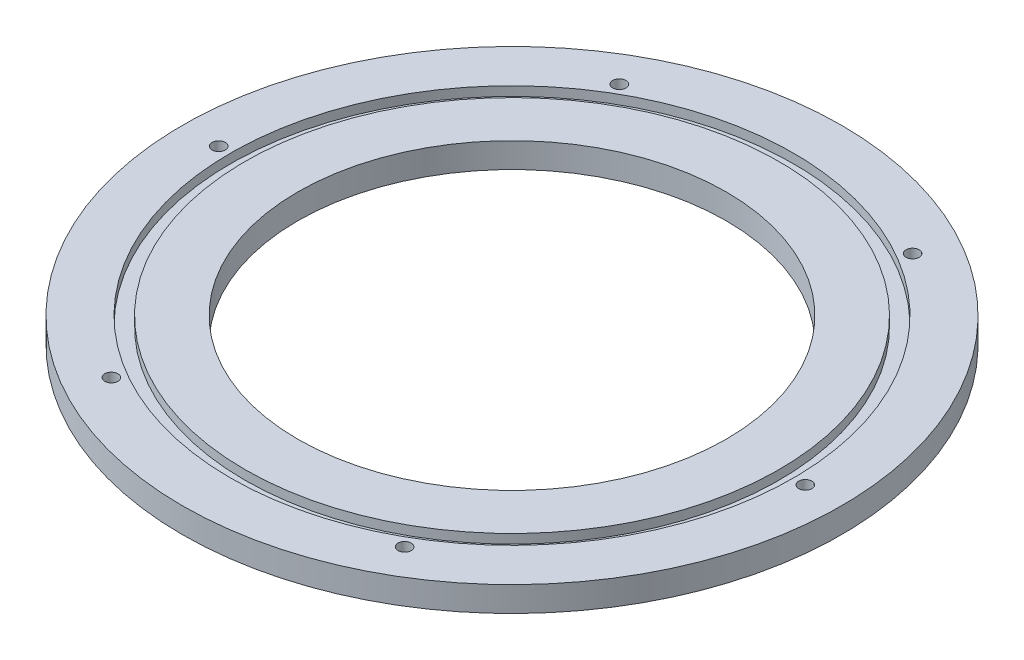
ISO-10303-21;
HEADER;
FILE_DESCRIPTION(('STEP AP214'),'2;1');
FILE_NAME('part.step','',(''),(''),'','','');
FILE_SCHEMA(('AUTOMOTIVE_DESIGN { 1 0 10303 214 1 1 1 1 }'));
ENDSEC;
DATA;
#1=APPLICATION_CONTEXT('core data for automotive mechanical design processes');
#2=APPLICATION_PROTOCOL_DEFINITION('international standard','automotive_design',2000,#1);
#3=PRODUCT_CONTEXT('',#1,'mechanical');
#4=PRODUCT('Part','Part','',(#3));
#5=PRODUCT_RELATED_PRODUCT_CATEGORY('part','',(#4));
#6=PRODUCT_DEFINITION_FORMATION('','',#4);
#7=PRODUCT_DEFINITION_CONTEXT('part definition',#1,'design');
#8=PRODUCT_DEFINITION('design','',#6,#7);
#9=PRODUCT_DEFINITION_SHAPE('','',#8);
#10=(LENGTH_UNIT() NAMED_UNIT(*) SI_UNIT(.MILLI.,.METRE.));
#11=(NAMED_UNIT(*) PLANE_ANGLE_UNIT() SI_UNIT($,.RADIAN.));
#12=(NAMED_UNIT(*) SI_UNIT($,.STERADIAN.) SOLID_ANGLE_UNIT());
#13=UNCERTAINTY_MEASURE_WITH_UNIT(LENGTH_MEASURE(1.E-05),#10,'distance_accuracy_value','');
#14=(GEOMETRIC_REPRESENTATION_CONTEXT(3) GLOBAL_UNCERTAINTY_ASSIGNED_CONTEXT((#13)) GLOBAL_UNIT_ASSIGNED_CONTEXT((#10,
#11,#12)) REPRESENTATION_CONTEXT('',''));
#15=CARTESIAN_POINT('',(0.,0.,0.));
#16=DIRECTION('',(0.,0.,1.));
#17=DIRECTION('',(1.,0.,0.));
#18=AXIS2_PLACEMENT_3D('',#15,#16,#17);
#19=CARTESIAN_POINT('',(0.,9.5,0.));
#20=DIRECTION('',(0.,1.,0.));
#21=DIRECTION('',(0.,0.,1.));
#22=AXIS2_PLACEMENT_3D('',#19,#20,#21);
#23=PLANE('',#22);
#24=CARTESIAN_POINT('',(0.,9.5,0.));
#25=DIRECTION('',(0.,1.,0.));
#26=DIRECTION('',(0.,0.,1.));
#27=AXIS2_PLACEMENT_3D('',#24,#25,#26);
#28=CIRCLE('',#27,162.5);
#29=CARTESIAN_POINT('',(0.,9.5,162.5));
#30=VERTEX_POINT('',#29);
#31=EDGE_CURVE('E48',#30,#30,#28,.T.);
#32=ORIENTED_EDGE('',*,*,#31,.F.);
#33=EDGE_LOOP('',(#32));
#34=FACE_BOUND('',#33,.T.);
#35=CARTESIAN_POINT('',(0.,9.5,0.));
#36=DIRECTION('',(0.,1.,0.));
#37=DIRECTION('',(0.,0.,1.));
#38=AXIS2_PLACEMENT_3D('',#35,#36,#37);
#39=CIRCLE('',#38,202.5);
#40=CARTESIAN_POINT('',(0.,9.5,202.5));
#41=VERTEX_POINT('',#40);
#42=EDGE_CURVE('E62',#41,#41,#39,.T.);
#43=ORIENTED_EDGE('',*,*,#42,.T.);
#44=EDGE_LOOP('',(#43));
#45=FACE_BOUND('',#44,.T.);
#46=ADVANCED_FACE('F37',(#34,#45),#23,.T.);
#47=CARTESIAN_POINT('',(-111.250000000001,9.5,-192.690652342037));
#48=DIRECTION('',(0.,-1.,0.));
#49=DIRECTION('',(0.,0.,-1.));
#50=AXIS2_PLACEMENT_3D('',#47,#48,#49);
#51=CIRCLE('',#50,5.00000000000001);
#52=CARTESIAN_POINT('',(-111.250000000001,9.5,-197.690652342037));
#53=VERTEX_POINT('',#52);
#54=EDGE_CURVE('E89',#53,#53,#51,.T.);
#55=ORIENTED_EDGE('',*,*,#54,.T.);
#56=EDGE_LOOP('',(#55));
#57=FACE_BOUND('',#56,.T.);
#58=CARTESIAN_POINT('',(-111.250000000001,9.5,192.690652342037));
#59=DIRECTION('',(0.,-1.,0.));
#60=DIRECTION('',(0.,0.,1.));
#61=AXIS2_PLACEMENT_3D('',#58,#59,#60);
#62=CIRCLE('',#61,5.00000000000001);
#63=CARTESIAN_POINT('',(-111.250000000001,9.5,197.690652342037));
#64=VERTEX_POINT('',#63);
#65=EDGE_CURVE('E78',#64,#64,#62,.T.);
#66=ORIENTED_EDGE('',*,*,#65,.T.);
#67=EDGE_LOOP('',(#66));
#68=FACE_BOUND('',#67,.T.);
#69=CARTESIAN_POINT('',(-222.5,9.5,-1.55431223447522E-12));
#70=DIRECTION('',(0.,-1.,0.));
#71=DIRECTION('',(0.,0.,1.));
#72=AXIS2_PLACEMENT_3D('',#69,#70,#71);
#73=CIRCLE('',#72,4.99999999999992);
#74=CARTESIAN_POINT('',(-222.5,9.5,4.99999999999837));
#75=VERTEX_POINT('',#74);
#76=EDGE_CURVE('E77',#75,#75,#73,.T.);
#77=ORIENTED_EDGE('',*,*,#76,.T.);
#78=EDGE_LOOP('',(#77));
#79=FACE_BOUND('',#78,.T.);
#80=CARTESIAN_POINT('',(222.5,9.5,0.));
#81=DIRECTION('',(0.,-1.,0.));
#82=DIRECTION('',(0.,0.,-1.));
#83=AXIS2_PLACEMENT_3D('',#80,#81,#82);
#84=CIRCLE('',#83,4.99999999999999);
#85=CARTESIAN_POINT('',(222.5,9.5,-4.99999999999999));
#86=VERTEX_POINT('',#85);
#87=EDGE_CURVE('E71',#86,#86,#84,.T.);
#88=ORIENTED_EDGE('',*,*,#87,.T.);
#89=EDGE_LOOP('',(#88));
#90=FACE_BOUND('',#89,.T.);
#91=CARTESIAN_POINT('',(111.25,9.5,-192.690652342038));
#92=DIRECTION('',(0.,-1.,0.));
#93=DIRECTION('',(0.,0.,1.));
#94=AXIS2_PLACEMENT_3D('',#91,#92,#93);
#95=CIRCLE('',#94,5.00000000000001);
#96=CARTESIAN_POINT('',(111.25,9.5,-187.690652342038));
#97=VERTEX_POINT('',#96);
#98=EDGE_CURVE('E90',#97,#97,#95,.T.);
#99=ORIENTED_EDGE('',*,*,#98,.T.);
#100=EDGE_LOOP('',(#99));
#101=FACE_BOUND('',#100,.T.);
#102=CARTESIAN_POINT('',(111.25,9.5,192.690652342038));
#103=DIRECTION('',(0.,-1.,0.));
#104=DIRECTION('',(0.,0.,-1.));
#105=AXIS2_PLACEMENT_3D('',#102,#103,#104);
#106=CIRCLE('',#105,5.00000000000001);
#107=CARTESIAN_POINT('',(111.25,9.5,187.690652342038));
#108=VERTEX_POINT('',#107);
#109=EDGE_CURVE('E65',#108,#108,#106,.T.);
#110=ORIENTED_EDGE('',*,*,#109,.T.);
#111=EDGE_LOOP('',(#110));
#112=FACE_BOUND('',#111,.T.);
#113=CARTESIAN_POINT('',(0.,9.5,0.));
#114=DIRECTION('',(0.,1.,0.));
#115=DIRECTION('',(0.,0.,1.));
#116=AXIS2_PLACEMENT_3D('',#113,#114,#115);
#117=CIRCLE('',#116,213.5);
#118=CARTESIAN_POINT('',(0.,9.5,213.5));
#119=VERTEX_POINT('',#118);
#120=EDGE_CURVE('E56',#119,#119,#117,.T.);
#121=ORIENTED_EDGE('',*,*,#120,.F.);
#122=EDGE_LOOP('',(#121));
#123=FACE_BOUND('',#122,.T.);
#124=CARTESIAN_POINT('',(0.,9.5,0.));
#125=DIRECTION('',(0.,1.,0.));
#126=DIRECTION('',(0.,0.,1.));
#127=AXIS2_PLACEMENT_3D('',#124,#125,#126);
#128=CIRCLE('',#127,250.);
#129=CARTESIAN_POINT('',(0.,9.5,250.));
#130=VERTEX_POINT('',#129);
#131=EDGE_CURVE('E10',#130,#130,#128,.T.);
#132=ORIENTED_EDGE('',*,*,#131,.T.);
#133=EDGE_LOOP('',(#132));
#134=FACE_BOUND('',#133,.T.);
#135=ADVANCED_FACE('F104',(#57,#68,#79,#90,#101,#112,#123,#134),#23,.T.);
#136=CARTESIAN_POINT('',(0.,-9.5,0.));
#137=DIRECTION('',(0.,1.,0.));
#138=DIRECTION('',(0.,0.,1.));
#139=AXIS2_PLACEMENT_3D('',#136,#137,#138);
#140=PLANE('',#139);
#141=CARTESIAN_POINT('',(-111.250000000001,-9.5,-192.690652342037));
#142=DIRECTION('',(0.,-1.,0.));
#143=DIRECTION('',(0.,0.,-1.));
#144=AXIS2_PLACEMENT_3D('',#141,#142,#143);
#145=CIRCLE('',#144,5.00000000000001);
#146=CARTESIAN_POINT('',(-111.250000000001,-9.5,-197.690652342037));
#147=VERTEX_POINT('',#146);
#148=EDGE_CURVE('E86',#147,#147,#145,.T.);
#149=ORIENTED_EDGE('',*,*,#148,.F.);
#150=EDGE_LOOP('',(#149));
#151=FACE_BOUND('',#150,.T.);
#152=CARTESIAN_POINT('',(-111.250000000001,-9.5,192.690652342037));
#153=DIRECTION('',(0.,-1.,0.));
#154=DIRECTION('',(0.,0.,1.));
#155=AXIS2_PLACEMENT_3D('',#152,#153,#154);
#156=CIRCLE('',#155,5.00000000000001);
#157=CARTESIAN_POINT('',(-111.250000000001,-9.5,197.690652342037));
#158=VERTEX_POINT('',#157);
#159=EDGE_CURVE('E93',#158,#158,#156,.T.);
#160=ORIENTED_EDGE('',*,*,#159,.F.);
#161=EDGE_LOOP('',(#160));
#162=FACE_BOUND('',#161,.T.);
#163=CARTESIAN_POINT('',(-222.5,-9.5,-1.55431223447522E-12));
#164=DIRECTION('',(0.,-1.,0.));
#165=DIRECTION('',(0.,0.,1.));
#166=AXIS2_PLACEMENT_3D('',#163,#164,#165);
#167=CIRCLE('',#166,4.99999999999992);
#168=CARTESIAN_POINT('',(-222.5,-9.5,4.99999999999837));
#169=VERTEX_POINT('',#168);
#170=EDGE_CURVE('E74',#169,#169,#167,.T.);
#171=ORIENTED_EDGE('',*,*,#170,.F.);
#172=EDGE_LOOP('',(#171));
#173=FACE_BOUND('',#172,.T.);
#174=CARTESIAN_POINT('',(222.5,-9.5,0.));
#175=DIRECTION('',(0.,-1.,0.));
#176=DIRECTION('',(0.,0.,-1.));
#177=AXIS2_PLACEMENT_3D('',#174,#175,#176);
#178=CIRCLE('',#177,4.99999999999999);
#179=CARTESIAN_POINT('',(222.5,-9.5,-4.99999999999999));
#180=VERTEX_POINT('',#179);
#181=EDGE_CURVE('E81',#180,#180,#178,.T.);
#182=ORIENTED_EDGE('',*,*,#181,.F.);
#183=EDGE_LOOP('',(#182));
#184=FACE_BOUND('',#183,.T.);
#185=CARTESIAN_POINT('',(111.25,-9.5,-192.690652342038));
#186=DIRECTION('',(0.,-1.,0.));
#187=DIRECTION('',(0.,0.,1.));
#188=AXIS2_PLACEMENT_3D('',#185,#186,#187);
#189=CIRCLE('',#188,5.00000000000001);
#190=CARTESIAN_POINT('',(111.25,-9.5,-187.690652342038));
#191=VERTEX_POINT('',#190);
#192=EDGE_CURVE('E98',#191,#191,#189,.T.);
#193=ORIENTED_EDGE('',*,*,#192,.F.);
#194=EDGE_LOOP('',(#193));
#195=FACE_BOUND('',#194,.T.);
#196=CARTESIAN_POINT('',(111.25,-9.5,192.690652342038));
#197=DIRECTION('',(0.,-1.,0.));
#198=DIRECTION('',(0.,0.,-1.));
#199=AXIS2_PLACEMENT_3D('',#196,#197,#198);
#200=CIRCLE('',#199,5.00000000000001);
#201=CARTESIAN_POINT('',(111.25,-9.5,187.690652342038));
#202=VERTEX_POINT('',#201);
#203=EDGE_CURVE('E68',#202,#202,#200,.T.);
#204=ORIENTED_EDGE('',*,*,#203,.F.);
#205=EDGE_LOOP('',(#204));
#206=FACE_BOUND('',#205,.T.);
#207=CARTESIAN_POINT('',(0.,-9.5,0.));
#208=DIRECTION('',(0.,1.,0.));
#209=DIRECTION('',(0.,0.,1.));
#210=AXIS2_PLACEMENT_3D('',#207,#208,#209);
#211=CIRCLE('',#210,250.);
#212=CARTESIAN_POINT('',(0.,-9.5,250.));
#213=VERTEX_POINT('',#212);
#214=EDGE_CURVE('E41',#213,#213,#211,.T.);
#215=ORIENTED_EDGE('',*,*,#214,.F.);
#216=EDGE_LOOP('',(#215));
#217=FACE_BOUND('',#216,.T.);
#218=CARTESIAN_POINT('',(0.,-9.5,0.));
#219=DIRECTION('',(0.,1.,0.));
#220=DIRECTION('',(0.,0.,1.));
#221=AXIS2_PLACEMENT_3D('',#218,#219,#220);
#222=CIRCLE('',#221,162.5);
#223=CARTESIAN_POINT('',(0.,-9.5,162.5));
#224=VERTEX_POINT('',#223);
#225=EDGE_CURVE('E50',#224,#224,#222,.T.);
#226=ORIENTED_EDGE('',*,*,#225,.T.);
#227=EDGE_LOOP('',(#226));
#228=FACE_BOUND('',#227,.T.);
#229=ADVANCED_FACE('F115',(#151,#162,#173,#184,#195,#206,#217,#228),#140,.F.);
#230=CARTESIAN_POINT('',(0.,9.5,0.));
#231=DIRECTION('',(0.,-1.,0.));
#232=DIRECTION('',(0.,0.,-1.));
#233=AXIS2_PLACEMENT_3D('',#230,#231,#232);
#234=CYLINDRICAL_SURFACE('',#233,250.);
#235=ORIENTED_EDGE('',*,*,#131,.F.);
#236=EDGE_LOOP('',(#235));
#237=FACE_BOUND('',#236,.T.);
#238=ORIENTED_EDGE('',*,*,#214,.T.);
#239=EDGE_LOOP('',(#238));
#240=FACE_BOUND('',#239,.T.);
#241=ADVANCED_FACE('F39',(#237,#240),#234,.T.);
#242=CARTESIAN_POINT('',(0.,9.5,0.));
#243=DIRECTION('',(0.,-1.,0.));
#244=DIRECTION('',(0.,0.,-1.));
#245=AXIS2_PLACEMENT_3D('',#242,#243,#244);
#246=CYLINDRICAL_SURFACE('',#245,162.5);
#247=ORIENTED_EDGE('',*,*,#31,.T.);
#248=EDGE_LOOP('',(#247));
#249=FACE_BOUND('',#248,.T.);
#250=ORIENTED_EDGE('',*,*,#225,.F.);
#251=EDGE_LOOP('',(#250));
#252=FACE_BOUND('',#251,.T.);
#253=ADVANCED_FACE('F125',(#249,#252),#246,.F.);
#254=CARTESIAN_POINT('',(0.,2.5,0.));
#255=DIRECTION('',(0.,1.,0.));
#256=DIRECTION('',(0.,0.,1.));
#257=AXIS2_PLACEMENT_3D('',#254,#255,#256);
#258=CYLINDRICAL_SURFACE('',#257,213.5);
#259=CARTESIAN_POINT('',(0.,2.5,0.));
#260=DIRECTION('',(0.,1.,0.));
#261=DIRECTION('',(0.,0.,1.));
#262=AXIS2_PLACEMENT_3D('',#259,#260,#261);
#263=CIRCLE('',#262,213.5);
#264=CARTESIAN_POINT('',(0.,2.5,213.5));
#265=VERTEX_POINT('',#264);
#266=EDGE_CURVE('E53',#265,#265,#263,.T.);
#267=ORIENTED_EDGE('',*,*,#266,.F.);
#268=EDGE_LOOP('',(#267));
#269=FACE_BOUND('',#268,.T.);
#270=ORIENTED_EDGE('',*,*,#120,.T.);
#271=EDGE_LOOP('',(#270));
#272=FACE_BOUND('',#271,.T.);
#273=ADVANCED_FACE('F127',(#269,#272),#258,.F.);
#274=CARTESIAN_POINT('',(0.,2.5,0.));
#275=DIRECTION('',(0.,1.,0.));
#276=DIRECTION('',(0.,0.,1.));
#277=AXIS2_PLACEMENT_3D('',#274,#275,#276);
#278=PLANE('',#277);
#279=CARTESIAN_POINT('',(0.,2.5,0.));
#280=DIRECTION('',(0.,1.,0.));
#281=DIRECTION('',(0.,0.,1.));
#282=AXIS2_PLACEMENT_3D('',#279,#280,#281);
#283=CIRCLE('',#282,202.5);
#284=CARTESIAN_POINT('',(0.,2.5,202.5));
#285=VERTEX_POINT('',#284);
#286=EDGE_CURVE('E59',#285,#285,#283,.T.);
#287=ORIENTED_EDGE('',*,*,#286,.F.);
#288=EDGE_LOOP('',(#287));
#289=FACE_BOUND('',#288,.T.);
#290=ORIENTED_EDGE('',*,*,#266,.T.);
#291=EDGE_LOOP('',(#290));
#292=FACE_BOUND('',#291,.T.);
#293=ADVANCED_FACE('F134',(#289,#292),#278,.T.);
#294=CARTESIAN_POINT('',(0.,2.5,0.));
#295=DIRECTION('',(0.,1.,0.));
#296=DIRECTION('',(0.,0.,1.));
#297=AXIS2_PLACEMENT_3D('',#294,#295,#296);
#298=CYLINDRICAL_SURFACE('',#297,202.5);
#299=ORIENTED_EDGE('',*,*,#286,.T.);
#300=EDGE_LOOP('',(#299));
#301=FACE_BOUND('',#300,.T.);
#302=ORIENTED_EDGE('',*,*,#42,.F.);
#303=EDGE_LOOP('',(#302));
#304=FACE_BOUND('',#303,.T.);
#305=ADVANCED_FACE('F150',(#301,#304),#298,.T.);
#306=CARTESIAN_POINT('',(111.25,9.5,192.690652342038));
#307=DIRECTION('',(0.,-1.,0.));
#308=DIRECTION('',(0.,0.,-1.));
#309=AXIS2_PLACEMENT_3D('',#306,#307,#308);
#310=CYLINDRICAL_SURFACE('',#309,5.00000000000001);
#311=ORIENTED_EDGE('',*,*,#109,.F.);
#312=EDGE_LOOP('',(#311));
#313=FACE_BOUND('',#312,.T.);
#314=ORIENTED_EDGE('',*,*,#203,.T.);
#315=EDGE_LOOP('',(#314));
#316=FACE_BOUND('',#315,.T.);
#317=ADVANCED_FACE('F111',(#313,#316),#310,.F.);
#318=CARTESIAN_POINT('',(111.25,9.5,-192.690652342038));
#319=DIRECTION('',(0.,-1.,0.));
#320=DIRECTION('',(0.,0.,-1.));
#321=AXIS2_PLACEMENT_3D('',#318,#319,#320);
#322=CYLINDRICAL_SURFACE('',#321,5.00000000000001);
#323=ORIENTED_EDGE('',*,*,#98,.F.);
#324=EDGE_LOOP('',(#323));
#325=FACE_BOUND('',#324,.T.);
#326=ORIENTED_EDGE('',*,*,#192,.T.);
#327=EDGE_LOOP('',(#326));
#328=FACE_BOUND('',#327,.T.);
#329=ADVANCED_FACE('F107',(#325,#328),#322,.F.);
#330=CARTESIAN_POINT('',(222.5,9.5,0.));
#331=DIRECTION('',(0.,-1.,0.));
#332=DIRECTION('',(0.,0.,-1.));
#333=AXIS2_PLACEMENT_3D('',#330,#331,#332);
#334=CYLINDRICAL_SURFACE('',#333,4.99999999999999);
#335=ORIENTED_EDGE('',*,*,#87,.F.);
#336=EDGE_LOOP('',(#335));
#337=FACE_BOUND('',#336,.T.);
#338=ORIENTED_EDGE('',*,*,#181,.T.);
#339=EDGE_LOOP('',(#338));
#340=FACE_BOUND('',#339,.T.);
#341=ADVANCED_FACE('F110',(#337,#340),#334,.F.);
#342=CARTESIAN_POINT('',(-222.5,9.5,-1.55431223447522E-12));
#343=DIRECTION('',(0.,-1.,0.));
#344=DIRECTION('',(0.,0.,-1.));
#345=AXIS2_PLACEMENT_3D('',#342,#343,#344);
#346=CYLINDRICAL_SURFACE('',#345,4.99999999999992);
#347=ORIENTED_EDGE('',*,*,#76,.F.);
#348=EDGE_LOOP('',(#347));
#349=FACE_BOUND('',#348,.T.);
#350=ORIENTED_EDGE('',*,*,#170,.T.);
#351=EDGE_LOOP('',(#350));
#352=FACE_BOUND('',#351,.T.);
#353=ADVANCED_FACE('F163',(#349,#352),#346,.F.);
#354=CARTESIAN_POINT('',(-111.250000000001,9.5,192.690652342037));
#355=DIRECTION('',(0.,-1.,0.));
#356=DIRECTION('',(0.,0.,-1.));
#357=AXIS2_PLACEMENT_3D('',#354,#355,#356);
#358=CYLINDRICAL_SURFACE('',#357,5.00000000000001);
#359=ORIENTED_EDGE('',*,*,#65,.F.);
#360=EDGE_LOOP('',(#359));
#361=FACE_BOUND('',#360,.T.);
#362=ORIENTED_EDGE('',*,*,#159,.T.);
#363=EDGE_LOOP('',(#362));
#364=FACE_BOUND('',#363,.T.);
#365=ADVANCED_FACE('F166',(#361,#364),#358,.F.);
#366=CARTESIAN_POINT('',(-111.250000000001,9.5,-192.690652342037));
#367=DIRECTION('',(0.,-1.,0.));
#368=DIRECTION('',(0.,0.,-1.));
#369=AXIS2_PLACEMENT_3D('',#366,#367,#368);
#370=CYLINDRICAL_SURFACE('',#369,5.00000000000001);
#371=ORIENTED_EDGE('',*,*,#54,.F.);
#372=EDGE_LOOP('',(#371));
#373=FACE_BOUND('',#372,.T.);
#374=ORIENTED_EDGE('',*,*,#148,.T.);
#375=EDGE_LOOP('',(#374));
#376=FACE_BOUND('',#375,.T.);
#377=ADVANCED_FACE('F171',(#373,#376),#370,.F.);
#378=CLOSED_SHELL('',(#46,#135,#229,#241,#253,#273,#293,#305,#317,#329,#341,#353,#365,#377));
#379=MANIFOLD_SOLID_BREP('B2',#378);
#380=ADVANCED_BREP_SHAPE_REPRESENTATION('',(#18,#379),#14);
#381=SHAPE_DEFINITION_REPRESENTATION(#9,#380);
ENDSEC;
END-ISO-10303-21;
